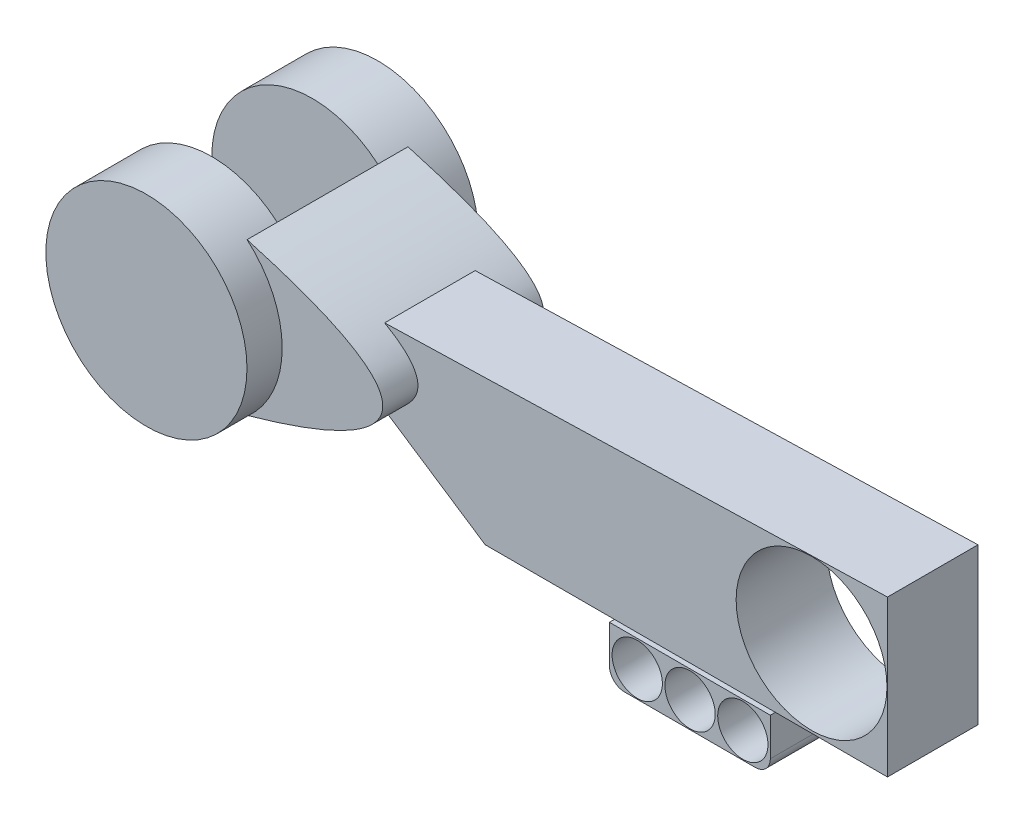
ISO-10303-21;
HEADER;
FILE_DESCRIPTION(('STEP AP214'),'2;1');
FILE_NAME('part.step','',(''),(''),'','','');
FILE_SCHEMA(('AUTOMOTIVE_DESIGN { 1 0 10303 214 1 1 1 1 }'));
ENDSEC;
DATA;
#1=APPLICATION_CONTEXT('core data for automotive mechanical design processes');
#2=APPLICATION_PROTOCOL_DEFINITION('international standard','automotive_design',2000,#1);
#3=PRODUCT_CONTEXT('',#1,'mechanical');
#4=PRODUCT('Part','Part','',(#3));
#5=PRODUCT_RELATED_PRODUCT_CATEGORY('part','',(#4));
#6=PRODUCT_DEFINITION_FORMATION('','',#4);
#7=PRODUCT_DEFINITION_CONTEXT('part definition',#1,'design');
#8=PRODUCT_DEFINITION('design','',#6,#7);
#9=PRODUCT_DEFINITION_SHAPE('','',#8);
#10=(LENGTH_UNIT() NAMED_UNIT(*) SI_UNIT(.MILLI.,.METRE.));
#11=(NAMED_UNIT(*) PLANE_ANGLE_UNIT() SI_UNIT($,.RADIAN.));
#12=(NAMED_UNIT(*) SI_UNIT($,.STERADIAN.) SOLID_ANGLE_UNIT());
#13=UNCERTAINTY_MEASURE_WITH_UNIT(LENGTH_MEASURE(1.E-05),#10,'distance_accuracy_value','');
#14=(GEOMETRIC_REPRESENTATION_CONTEXT(3) GLOBAL_UNCERTAINTY_ASSIGNED_CONTEXT((#13)) GLOBAL_UNIT_ASSIGNED_CONTEXT((#10,
#11,#12)) REPRESENTATION_CONTEXT('',''));
#15=CARTESIAN_POINT('',(0.,0.,0.));
#16=DIRECTION('',(0.,0.,1.));
#17=DIRECTION('',(1.,0.,0.));
#18=AXIS2_PLACEMENT_3D('',#15,#16,#17);
#19=CARTESIAN_POINT('',(0.,-2.06849962744664,-1.3));
#20=DIRECTION('',(0.,1.,0.));
#21=DIRECTION('',(-1.,0.,0.));
#22=AXIS2_PLACEMENT_3D('',#19,#20,#21);
#23=PLANE('',#22);
#24=DIRECTION('',(0.,0.,-1.));
#25=VECTOR('',#24,1.);
#26=CARTESIAN_POINT('',(7.90753190744176,-2.06849962744664,-1.2));
#27=LINE('',#26,#25);
#28=CARTESIAN_POINT('',(7.90753190744176,-2.06849962744664,-1.3));
#29=VERTEX_POINT('',#28);
#30=CARTESIAN_POINT('',(7.90753190744176,-2.06849962744664,-3.1));
#31=VERTEX_POINT('',#30);
#32=EDGE_CURVE('E47',#29,#31,#27,.T.);
#33=ORIENTED_EDGE('',*,*,#32,.F.);
#34=DIRECTION('',(1.,0.,0.));
#35=VECTOR('',#34,1.);
#36=CARTESIAN_POINT('',(0.,-2.06849962744664,-1.3));
#37=LINE('',#36,#35);
#38=CARTESIAN_POINT('',(5.33751299580124,-2.06849962744664,-1.3));
#39=VERTEX_POINT('',#38);
#40=EDGE_CURVE('E278',#39,#29,#37,.T.);
#41=ORIENTED_EDGE('',*,*,#40,.F.);
#42=DIRECTION('',(0.,0.,-1.));
#43=VECTOR('',#42,1.);
#44=CARTESIAN_POINT('',(5.33751299580124,-2.06849962744664,-1.3));
#45=LINE('',#44,#43);
#46=CARTESIAN_POINT('',(5.33751299580124,-2.06849962744664,-3.1));
#47=VERTEX_POINT('',#46);
#48=EDGE_CURVE('E297',#39,#47,#45,.T.);
#49=ORIENTED_EDGE('',*,*,#48,.T.);
#50=DIRECTION('',(1.,0.,0.));
#51=VECTOR('',#50,1.);
#52=CARTESIAN_POINT('',(0.,-2.06849962744664,-3.1));
#53=LINE('',#52,#51);
#54=EDGE_CURVE('E260',#47,#31,#53,.T.);
#55=ORIENTED_EDGE('',*,*,#54,.T.);
#56=EDGE_LOOP('',(#33,#41,#49,#55));
#57=FACE_BOUND('',#56,.T.);
#58=ADVANCED_FACE('F38',(#57),#23,.F.);
#59=CARTESIAN_POINT('',(0.,0.,-2.2));
#60=DIRECTION('',(0.,0.,1.));
#61=DIRECTION('',(1.,0.,0.));
#62=AXIS2_PLACEMENT_3D('',#59,#60,#61);
#63=CYLINDRICAL_SURFACE('',#62,2.);
#64=CARTESIAN_POINT('',(0.,0.,-3.2));
#65=DIRECTION('',(0.,0.,1.));
#66=DIRECTION('',(1.,0.,0.));
#67=AXIS2_PLACEMENT_3D('',#64,#65,#66);
#68=CIRCLE('',#67,2.);
#69=CARTESIAN_POINT('',(1.31954733992159,-1.50292874671618,-3.2));
#70=VERTEX_POINT('',#69);
#71=CARTESIAN_POINT('',(1.30190533383502,1.51823664220434,-3.2));
#72=VERTEX_POINT('',#71);
#73=EDGE_CURVE('E238',#70,#72,#68,.T.);
#74=ORIENTED_EDGE('',*,*,#73,.F.);
#75=DIRECTION('',(0.,0.,1.));
#76=VECTOR('',#75,1.);
#77=CARTESIAN_POINT('',(1.31954733992159,-1.50292874671618,-2.2));
#78=LINE('',#77,#76);
#79=CARTESIAN_POINT('',(1.31954733992159,-1.50292874671618,-1.2));
#80=VERTEX_POINT('',#79);
#81=EDGE_CURVE('E685',#70,#80,#78,.T.);
#82=ORIENTED_EDGE('',*,*,#81,.T.);
#83=CARTESIAN_POINT('',(0.,0.,-1.2));
#84=DIRECTION('',(0.,0.,1.));
#85=DIRECTION('',(1.,0.,0.));
#86=AXIS2_PLACEMENT_3D('',#83,#84,#85);
#87=CIRCLE('',#86,2.);
#88=CARTESIAN_POINT('',(1.30190533383502,1.51823664220434,-1.2));
#89=VERTEX_POINT('',#88);
#90=EDGE_CURVE('E681',#80,#89,#87,.T.);
#91=ORIENTED_EDGE('',*,*,#90,.T.);
#92=DIRECTION('',(0.,0.,1.));
#93=VECTOR('',#92,1.);
#94=CARTESIAN_POINT('',(1.30190533383502,1.51823664220434,-2.2));
#95=LINE('',#94,#93);
#96=EDGE_CURVE('E693',#72,#89,#95,.T.);
#97=ORIENTED_EDGE('',*,*,#96,.F.);
#98=EDGE_LOOP('',(#74,#82,#91,#97));
#99=FACE_BOUND('',#98,.T.);
#100=ADVANCED_FACE('F326',(#99),#63,.F.);
#101=CARTESIAN_POINT('',(1.30190533383502,1.51823664220434,-2.2));
#102=CARTESIAN_POINT('',(6.68928221150625,0.00355034534943547,-2.2));
#103=CARTESIAN_POINT('',(1.31954733992159,-1.50292874671618,-2.2));
#104=B_SPLINE_CURVE_WITH_KNOTS('',2,(#101,#102,#103),.UNSPECIFIED.,.F.,.F.,(3,3),(0.,1.),.UNSPECIFIED.);
#105=DIRECTION('',(0.,0.,1.));
#106=VECTOR('',#105,1.);
#107=SURFACE_OF_LINEAR_EXTRUSION('',#104,#106);
#108=CARTESIAN_POINT('',(1.30190533383502,1.51823664220434,-3.1));
#109=CARTESIAN_POINT('',(6.68928221150625,0.00355034534943547,-3.1));
#110=CARTESIAN_POINT('',(1.31954733992159,-1.50292874671618,-3.1));
#111=B_SPLINE_CURVE_WITH_KNOTS('',2,(#108,#109,#110),.UNSPECIFIED.,.F.,.F.,(3,3),(0.,1.),.UNSPECIFIED.);
#112=CARTESIAN_POINT('',(3.33751296790909,0.753381438044723,-3.1));
#113=VERTEX_POINT('',#112);
#114=CARTESIAN_POINT('',(3.33751300161917,-0.74612100768577,-3.1));
#115=VERTEX_POINT('',#114);
#116=EDGE_CURVE('E248',#113,#115,#111,.T.);
#117=ORIENTED_EDGE('',*,*,#116,.T.);
#118=DIRECTION('',(0.,0.,-1.));
#119=VECTOR('',#118,1.);
#120=CARTESIAN_POINT('',(3.33751300161917,-0.74612100768577,-1.3));
#121=LINE('',#120,#119);
#122=CARTESIAN_POINT('',(3.33751300161917,-0.74612100768577,-1.3));
#123=VERTEX_POINT('',#122);
#124=EDGE_CURVE('E299',#123,#115,#121,.T.);
#125=ORIENTED_EDGE('',*,*,#124,.F.);
#126=CARTESIAN_POINT('',(1.30190533383502,1.51823664220434,-1.3));
#127=CARTESIAN_POINT('',(6.68928221150625,0.00355034534943547,-1.3));
#128=CARTESIAN_POINT('',(1.31954733992159,-1.50292874671618,-1.3));
#129=B_SPLINE_CURVE_WITH_KNOTS('',2,(#126,#127,#128),.UNSPECIFIED.,.F.,.F.,(3,3),(0.,1.),.UNSPECIFIED.);
#130=CARTESIAN_POINT('',(3.33751296790909,0.753381438044723,-1.3));
#131=VERTEX_POINT('',#130);
#132=EDGE_CURVE('E283',#131,#123,#129,.T.);
#133=ORIENTED_EDGE('',*,*,#132,.F.);
#134=DIRECTION('',(0.,0.,-1.));
#135=VECTOR('',#134,1.);
#136=CARTESIAN_POINT('',(3.33751296790909,0.753381438044723,-1.3));
#137=LINE('',#136,#135);
#138=EDGE_CURVE('E296',#131,#113,#137,.T.);
#139=ORIENTED_EDGE('',*,*,#138,.T.);
#140=EDGE_LOOP('',(#117,#125,#133,#139));
#141=FACE_BOUND('',#140,.T.);
#142=CARTESIAN_POINT('',(1.30190533383502,1.51823664220434,-3.8));
#143=CARTESIAN_POINT('',(6.68928221150625,0.00355034534943547,-3.8));
#144=CARTESIAN_POINT('',(1.31954733992159,-1.50292874671618,-3.8));
#145=B_SPLINE_CURVE_WITH_KNOTS('',2,(#142,#143,#144),.UNSPECIFIED.,.F.,.F.,(3,3),(0.,1.),.UNSPECIFIED.);
#146=CARTESIAN_POINT('',(1.30190533383502,1.51823664220434,-3.8));
#147=VERTEX_POINT('',#146);
#148=CARTESIAN_POINT('',(1.31954733992159,-1.50292874671618,-3.8));
#149=VERTEX_POINT('',#148);
#150=EDGE_CURVE('E262',#147,#149,#145,.T.);
#151=ORIENTED_EDGE('',*,*,#150,.F.);
#152=EDGE_CURVE('E316',#147,#72,#95,.T.);
#153=ORIENTED_EDGE('',*,*,#152,.T.);
#154=ORIENTED_EDGE('',*,*,#96,.T.);
#155=CARTESIAN_POINT('',(1.30190533383502,1.51823664220434,-0.6));
#156=VERTEX_POINT('',#155);
#157=EDGE_CURVE('E311',#89,#156,#95,.T.);
#158=ORIENTED_EDGE('',*,*,#157,.T.);
#159=CARTESIAN_POINT('',(1.30190533383502,1.51823664220434,-0.6));
#160=CARTESIAN_POINT('',(6.68928221150625,0.00355034534943547,-0.6));
#161=CARTESIAN_POINT('',(1.31954733992159,-1.50292874671618,-0.6));
#162=B_SPLINE_CURVE_WITH_KNOTS('',2,(#159,#160,#161),.UNSPECIFIED.,.F.,.F.,(3,3),(0.,1.),.UNSPECIFIED.);
#163=CARTESIAN_POINT('',(1.31954733992159,-1.50292874671618,-0.6));
#164=VERTEX_POINT('',#163);
#165=EDGE_CURVE('E295',#156,#164,#162,.T.);
#166=ORIENTED_EDGE('',*,*,#165,.T.);
#167=EDGE_CURVE('E686',#80,#164,#78,.T.);
#168=ORIENTED_EDGE('',*,*,#167,.F.);
#169=ORIENTED_EDGE('',*,*,#81,.F.);
#170=EDGE_CURVE('E684',#149,#70,#78,.T.);
#171=ORIENTED_EDGE('',*,*,#170,.F.);
#172=EDGE_LOOP('',(#151,#153,#154,#158,#166,#168,#169,#171));
#173=FACE_BOUND('',#172,.T.);
#174=ADVANCED_FACE('F322',(#141,#173),#107,.F.);
#175=CARTESIAN_POINT('',(0.,0.,-1.2));
#176=DIRECTION('',(0.,0.,1.));
#177=DIRECTION('',(1.,0.,0.));
#178=AXIS2_PLACEMENT_3D('',#175,#176,#177);
#179=CYLINDRICAL_SURFACE('',#178,2.);
#180=CARTESIAN_POINT('',(0.,0.,0.1));
#181=DIRECTION('',(0.,0.,1.));
#182=DIRECTION('',(1.,0.,0.));
#183=AXIS2_PLACEMENT_3D('',#180,#181,#182);
#184=CIRCLE('',#183,2.);
#185=CARTESIAN_POINT('',(2.,0.,0.1));
#186=VERTEX_POINT('',#185);
#187=EDGE_CURVE('E682',#186,#186,#184,.T.);
#188=ORIENTED_EDGE('',*,*,#187,.F.);
#189=EDGE_LOOP('',(#188));
#190=FACE_BOUND('',#189,.T.);
#191=CARTESIAN_POINT('',(0.,0.,-0.6));
#192=DIRECTION('',(0.,0.,1.));
#193=DIRECTION('',(-1.,0.,0.));
#194=AXIS2_PLACEMENT_3D('',#191,#192,#193);
#195=CIRCLE('',#194,2.);
#196=EDGE_CURVE('E306',#164,#156,#195,.T.);
#197=ORIENTED_EDGE('',*,*,#196,.T.);
#198=ORIENTED_EDGE('',*,*,#157,.F.);
#199=EDGE_CURVE('E670',#89,#80,#87,.T.);
#200=ORIENTED_EDGE('',*,*,#199,.T.);
#201=ORIENTED_EDGE('',*,*,#167,.T.);
#202=EDGE_LOOP('',(#197,#198,#200,#201));
#203=FACE_BOUND('',#202,.T.);
#204=ADVANCED_FACE('F40',(#190,#203),#179,.T.);
#205=CARTESIAN_POINT('',(0.,0.,-1.2));
#206=DIRECTION('',(0.,0.,1.));
#207=DIRECTION('',(1.,0.,0.));
#208=AXIS2_PLACEMENT_3D('',#205,#206,#207);
#209=PLANE('',#208);
#210=ORIENTED_EDGE('',*,*,#199,.F.);
#211=ORIENTED_EDGE('',*,*,#90,.F.);
#212=EDGE_LOOP('',(#210,#211));
#213=FACE_BOUND('',#212,.T.);
#214=ADVANCED_FACE('F332',(#213),#209,.F.);
#215=CARTESIAN_POINT('',(0.,0.,0.1));
#216=DIRECTION('',(0.,0.,1.));
#217=DIRECTION('',(1.,0.,0.));
#218=AXIS2_PLACEMENT_3D('',#215,#216,#217);
#219=PLANE('',#218);
#220=ORIENTED_EDGE('',*,*,#187,.T.);
#221=EDGE_LOOP('',(#220));
#222=FACE_BOUND('',#221,.T.);
#223=ADVANCED_FACE('F329',(#222),#219,.T.);
#224=CARTESIAN_POINT('',(4.00000427419228,0.00560214654675808,-0.6));
#225=DIRECTION('',(0.,0.,1.));
#226=DIRECTION('',(1.,0.,0.));
#227=AXIS2_PLACEMENT_3D('',#224,#225,#226);
#228=PLANE('',#227);
#229=ORIENTED_EDGE('',*,*,#165,.F.);
#230=ORIENTED_EDGE('',*,*,#196,.F.);
#231=EDGE_LOOP('',(#229,#230));
#232=FACE_BOUND('',#231,.T.);
#233=ADVANCED_FACE('F331',(#232),#228,.T.);
#234=CARTESIAN_POINT('',(13.3375129958012,4.32883877576709E-13,-1.3));
#235=DIRECTION('',(-1.,0.,0.));
#236=DIRECTION('',(0.,-1.,0.));
#237=AXIS2_PLACEMENT_3D('',#234,#235,#236);
#238=PLANE('',#237);
#239=DIRECTION('',(0.,0.,-1.));
#240=VECTOR('',#239,1.);
#241=CARTESIAN_POINT('',(13.3375129958012,-2.06849962744664,-1.3));
#242=LINE('',#241,#240);
#243=CARTESIAN_POINT('',(13.3375129958012,-2.06849962744664,-1.3));
#244=VERTEX_POINT('',#243);
#245=CARTESIAN_POINT('',(13.3375129958012,-2.06849962744664,-3.1));
#246=VERTEX_POINT('',#245);
#247=EDGE_CURVE('E292',#244,#246,#242,.T.);
#248=ORIENTED_EDGE('',*,*,#247,.T.);
#249=DIRECTION('',(0.,1.,0.));
#250=VECTOR('',#249,1.);
#251=CARTESIAN_POINT('',(13.3375129958012,4.32883877576709E-13,-3.1));
#252=LINE('',#251,#250);
#253=CARTESIAN_POINT('',(13.3375129958011,1.03150037255336,-3.1));
#254=VERTEX_POINT('',#253);
#255=EDGE_CURVE('E242',#246,#254,#252,.T.);
#256=ORIENTED_EDGE('',*,*,#255,.T.);
#257=DIRECTION('',(0.,0.,-1.));
#258=VECTOR('',#257,1.);
#259=CARTESIAN_POINT('',(13.3375129958011,1.03150037255336,-1.3));
#260=LINE('',#259,#258);
#261=CARTESIAN_POINT('',(13.3375129958011,1.03150037255336,-1.3));
#262=VERTEX_POINT('',#261);
#263=EDGE_CURVE('E293',#262,#254,#260,.T.);
#264=ORIENTED_EDGE('',*,*,#263,.F.);
#265=DIRECTION('',(0.,1.,0.));
#266=VECTOR('',#265,1.);
#267=CARTESIAN_POINT('',(13.3375129958012,4.32883877576709E-13,-1.3));
#268=LINE('',#267,#266);
#269=EDGE_CURVE('E275',#244,#262,#268,.T.);
#270=ORIENTED_EDGE('',*,*,#269,.F.);
#271=EDGE_LOOP('',(#248,#256,#264,#270));
#272=FACE_BOUND('',#271,.T.);
#273=ADVANCED_FACE('F365',(#272),#238,.F.);
#274=CARTESIAN_POINT('',(-0.0183571941936594,0.660048321889685,-1.3));
#275=DIRECTION('',(0.0278011443144739,-0.99961347348603,0.));
#276=DIRECTION('',(0.99961347348603,0.0278011443144739,0.));
#277=AXIS2_PLACEMENT_3D('',#274,#275,#276);
#278=PLANE('',#277);
#279=ORIENTED_EDGE('',*,*,#263,.T.);
#280=DIRECTION('',(-0.99961347348603,-0.0278011443144739,0.));
#281=VECTOR('',#280,1.);
#282=CARTESIAN_POINT('',(-0.0183571941936594,0.660048321889685,-3.1));
#283=LINE('',#282,#281);
#284=EDGE_CURVE('E245',#254,#113,#283,.T.);
#285=ORIENTED_EDGE('',*,*,#284,.T.);
#286=ORIENTED_EDGE('',*,*,#138,.F.);
#287=DIRECTION('',(-0.99961347348603,-0.0278011443144739,0.));
#288=VECTOR('',#287,1.);
#289=CARTESIAN_POINT('',(-0.0183571941936594,0.660048321889685,-1.3));
#290=LINE('',#289,#288);
#291=EDGE_CURVE('E287',#262,#131,#290,.T.);
#292=ORIENTED_EDGE('',*,*,#291,.F.);
#293=EDGE_LOOP('',(#279,#285,#286,#292));
#294=FACE_BOUND('',#293,.T.);
#295=ADVANCED_FACE('F360',(#294),#278,.F.);
#296=CARTESIAN_POINT('',(0.671971165599863,1.01630675925438,-1.3));
#297=DIRECTION('',(0.5515330665401,0.834153029433373,0.));
#298=DIRECTION('',(-0.834153029433373,0.5515330665401,0.));
#299=AXIS2_PLACEMENT_3D('',#296,#297,#298);
#300=PLANE('',#299);
#301=ORIENTED_EDGE('',*,*,#124,.T.);
#302=DIRECTION('',(0.834153029433373,-0.5515330665401,0.));
#303=VECTOR('',#302,1.);
#304=CARTESIAN_POINT('',(0.671971165599863,1.01630675925438,-3.1));
#305=LINE('',#304,#303);
#306=EDGE_CURVE('E253',#115,#47,#305,.T.);
#307=ORIENTED_EDGE('',*,*,#306,.T.);
#308=ORIENTED_EDGE('',*,*,#48,.F.);
#309=DIRECTION('',(0.834153029433373,-0.5515330665401,0.));
#310=VECTOR('',#309,1.);
#311=CARTESIAN_POINT('',(0.671971165599863,1.01630675925438,-1.3));
#312=LINE('',#311,#310);
#313=EDGE_CURVE('E280',#123,#39,#312,.T.);
#314=ORIENTED_EDGE('',*,*,#313,.F.);
#315=EDGE_LOOP('',(#301,#307,#308,#314));
#316=FACE_BOUND('',#315,.T.);
#317=ADVANCED_FACE('F352',(#316),#300,.F.);
#318=CARTESIAN_POINT('',(11.1075319074418,-2.06849962744664,-1.3));
#319=VERTEX_POINT('',#318);
#320=EDGE_CURVE('E56',#319,#244,#37,.T.);
#321=ORIENTED_EDGE('',*,*,#320,.F.);
#322=DIRECTION('',(0.,0.,-1.));
#323=VECTOR('',#322,1.);
#324=CARTESIAN_POINT('',(11.1075319074418,-2.06849962744664,-1.2));
#325=LINE('',#324,#323);
#326=CARTESIAN_POINT('',(11.1075319074418,-2.06849962744664,-3.1));
#327=VERTEX_POINT('',#326);
#328=EDGE_CURVE('E11',#319,#327,#325,.T.);
#329=ORIENTED_EDGE('',*,*,#328,.T.);
#330=EDGE_CURVE('E259',#327,#246,#53,.T.);
#331=ORIENTED_EDGE('',*,*,#330,.T.);
#332=ORIENTED_EDGE('',*,*,#247,.F.);
#333=EDGE_LOOP('',(#321,#329,#331,#332));
#334=FACE_BOUND('',#333,.T.);
#335=ADVANCED_FACE('F343',(#334),#23,.F.);
#336=CARTESIAN_POINT('',(0.,0.,-1.3));
#337=DIRECTION('',(0.,0.,-1.));
#338=DIRECTION('',(-1.,0.,0.));
#339=AXIS2_PLACEMENT_3D('',#336,#337,#338);
#340=PLANE('',#339);
#341=CARTESIAN_POINT('',(11.8275129958012,-0.521079468635167,-1.3));
#342=DIRECTION('',(0.,0.,-1.));
#343=DIRECTION('',(-1.,0.,0.));
#344=AXIS2_PLACEMENT_3D('',#341,#342,#343);
#345=CIRCLE('',#344,1.5);
#346=CARTESIAN_POINT('',(10.3275129958012,-0.521079468635167,-1.3));
#347=VERTEX_POINT('',#346);
#348=EDGE_CURVE('E274',#347,#347,#345,.T.);
#349=ORIENTED_EDGE('',*,*,#348,.T.);
#350=EDGE_LOOP('',(#349));
#351=FACE_BOUND('',#350,.T.);
#352=ORIENTED_EDGE('',*,*,#269,.T.);
#353=ORIENTED_EDGE('',*,*,#291,.T.);
#354=ORIENTED_EDGE('',*,*,#132,.T.);
#355=ORIENTED_EDGE('',*,*,#313,.T.);
#356=ORIENTED_EDGE('',*,*,#40,.T.);
#357=EDGE_CURVE('E281',#29,#319,#37,.T.);
#358=ORIENTED_EDGE('',*,*,#357,.T.);
#359=ORIENTED_EDGE('',*,*,#320,.T.);
#360=EDGE_LOOP('',(#352,#353,#354,#355,#356,#358,#359));
#361=FACE_BOUND('',#360,.T.);
#362=ADVANCED_FACE('F351',(#351,#361),#340,.F.);
#363=CARTESIAN_POINT('',(11.8275129958012,-0.521079468635167,-3.8));
#364=DIRECTION('',(0.,0.,1.));
#365=DIRECTION('',(1.,0.,0.));
#366=AXIS2_PLACEMENT_3D('',#363,#364,#365);
#367=CYLINDRICAL_SURFACE('',#366,1.5);
#368=ORIENTED_EDGE('',*,*,#348,.F.);
#369=EDGE_LOOP('',(#368));
#370=FACE_BOUND('',#369,.T.);
#371=CARTESIAN_POINT('',(11.8275129958012,-0.521079468635167,-3.1));
#372=DIRECTION('',(0.,0.,1.));
#373=DIRECTION('',(1.,0.,0.));
#374=AXIS2_PLACEMENT_3D('',#371,#372,#373);
#375=CIRCLE('',#374,1.5);
#376=CARTESIAN_POINT('',(13.3275129958012,-0.521079468635167,-3.1));
#377=VERTEX_POINT('',#376);
#378=EDGE_CURVE('E42',#377,#377,#375,.F.);
#379=ORIENTED_EDGE('',*,*,#378,.T.);
#380=EDGE_LOOP('',(#379));
#381=FACE_BOUND('',#380,.T.);
#382=ADVANCED_FACE('F357',(#370,#381),#367,.F.);
#383=CARTESIAN_POINT('',(4.00000427419228,0.00560214654675808,-3.8));
#384=DIRECTION('',(0.,0.,-1.));
#385=DIRECTION('',(1.,0.,0.));
#386=AXIS2_PLACEMENT_3D('',#383,#384,#385);
#387=PLANE('',#386);
#388=ORIENTED_EDGE('',*,*,#150,.T.);
#389=CARTESIAN_POINT('',(0.,0.,-3.8));
#390=DIRECTION('',(0.,0.,1.));
#391=DIRECTION('',(-1.,0.,0.));
#392=AXIS2_PLACEMENT_3D('',#389,#390,#391);
#393=CIRCLE('',#392,2.);
#394=EDGE_CURVE('E268',#149,#147,#393,.T.);
#395=ORIENTED_EDGE('',*,*,#394,.T.);
#396=EDGE_LOOP('',(#388,#395));
#397=FACE_BOUND('',#396,.T.);
#398=ADVANCED_FACE('F371',(#397),#387,.T.);
#399=CARTESIAN_POINT('',(0.,0.,-3.1));
#400=DIRECTION('',(0.,0.,1.));
#401=DIRECTION('',(-1.,0.,0.));
#402=AXIS2_PLACEMENT_3D('',#399,#400,#401);
#403=PLANE('',#402);
#404=ORIENTED_EDGE('',*,*,#378,.F.);
#405=EDGE_LOOP('',(#404));
#406=FACE_BOUND('',#405,.T.);
#407=ORIENTED_EDGE('',*,*,#255,.F.);
#408=ORIENTED_EDGE('',*,*,#330,.F.);
#409=EDGE_CURVE('E263',#31,#327,#53,.T.);
#410=ORIENTED_EDGE('',*,*,#409,.F.);
#411=ORIENTED_EDGE('',*,*,#54,.F.);
#412=ORIENTED_EDGE('',*,*,#306,.F.);
#413=ORIENTED_EDGE('',*,*,#116,.F.);
#414=ORIENTED_EDGE('',*,*,#284,.F.);
#415=EDGE_LOOP('',(#407,#408,#410,#411,#412,#413,#414));
#416=FACE_BOUND('',#415,.T.);
#417=ADVANCED_FACE('F375',(#406,#416),#403,.F.);
#418=CARTESIAN_POINT('',(0.,0.,-3.2));
#419=DIRECTION('',(0.,0.,-1.));
#420=DIRECTION('',(-1.,0.,0.));
#421=AXIS2_PLACEMENT_3D('',#418,#419,#420);
#422=CYLINDRICAL_SURFACE('',#421,2.);
#423=CARTESIAN_POINT('',(0.,0.,-4.5));
#424=DIRECTION('',(0.,0.,1.));
#425=DIRECTION('',(1.,0.,0.));
#426=AXIS2_PLACEMENT_3D('',#423,#424,#425);
#427=CIRCLE('',#426,2.);
#428=CARTESIAN_POINT('',(2.,0.,-4.5));
#429=VERTEX_POINT('',#428);
#430=EDGE_CURVE('E235',#429,#429,#427,.T.);
#431=ORIENTED_EDGE('',*,*,#430,.T.);
#432=EDGE_LOOP('',(#431));
#433=FACE_BOUND('',#432,.T.);
#434=EDGE_CURVE('E239',#72,#70,#68,.T.);
#435=ORIENTED_EDGE('',*,*,#434,.F.);
#436=ORIENTED_EDGE('',*,*,#152,.F.);
#437=ORIENTED_EDGE('',*,*,#394,.F.);
#438=ORIENTED_EDGE('',*,*,#170,.T.);
#439=EDGE_LOOP('',(#435,#436,#437,#438));
#440=FACE_BOUND('',#439,.T.);
#441=ADVANCED_FACE('F379',(#433,#440),#422,.T.);
#442=CARTESIAN_POINT('',(0.,0.,-3.2));
#443=DIRECTION('',(0.,0.,-1.));
#444=DIRECTION('',(1.,0.,0.));
#445=AXIS2_PLACEMENT_3D('',#442,#443,#444);
#446=PLANE('',#445);
#447=ORIENTED_EDGE('',*,*,#434,.T.);
#448=ORIENTED_EDGE('',*,*,#73,.T.);
#449=EDGE_LOOP('',(#447,#448));
#450=FACE_BOUND('',#449,.T.);
#451=ADVANCED_FACE('F383',(#450),#446,.F.);
#452=CARTESIAN_POINT('',(0.,0.,-4.5));
#453=DIRECTION('',(0.,0.,-1.));
#454=DIRECTION('',(1.,0.,0.));
#455=AXIS2_PLACEMENT_3D('',#452,#453,#454);
#456=PLANE('',#455);
#457=ORIENTED_EDGE('',*,*,#430,.F.);
#458=EDGE_LOOP('',(#457));
#459=FACE_BOUND('',#458,.T.);
#460=ADVANCED_FACE('F387',(#459),#456,.T.);
#461=CARTESIAN_POINT('',(11.1075319074418,-2.06849962744664,-1.2));
#462=DIRECTION('',(0.,1.,0.));
#463=DIRECTION('',(-1.,0.,0.));
#464=AXIS2_PLACEMENT_3D('',#461,#462,#463);
#465=PLANE('',#464);
#466=ORIENTED_EDGE('',*,*,#357,.F.);
#467=CARTESIAN_POINT('',(7.90753190744176,-2.06849962744664,-1.2));
#468=VERTEX_POINT('',#467);
#469=EDGE_CURVE('E226',#468,#29,#27,.T.);
#470=ORIENTED_EDGE('',*,*,#469,.F.);
#471=DIRECTION('',(1.,0.,0.));
#472=VECTOR('',#471,1.);
#473=CARTESIAN_POINT('',(11.1075319074418,-2.06849962744664,-1.2));
#474=LINE('',#473,#472);
#475=CARTESIAN_POINT('',(11.1075319074418,-2.06849962744664,-1.2));
#476=VERTEX_POINT('',#475);
#477=EDGE_CURVE('E172',#468,#476,#474,.T.);
#478=ORIENTED_EDGE('',*,*,#477,.T.);
#479=EDGE_CURVE('E49',#476,#319,#325,.T.);
#480=ORIENTED_EDGE('',*,*,#479,.T.);
#481=EDGE_LOOP('',(#466,#470,#478,#480));
#482=FACE_BOUND('',#481,.T.);
#483=ADVANCED_FACE('F391',(#482),#465,.T.);
#484=CARTESIAN_POINT('',(11.1075319074418,-2.06849962744664,-1.2));
#485=DIRECTION('',(1.,0.,0.));
#486=DIRECTION('',(0.,0.,-1.));
#487=AXIS2_PLACEMENT_3D('',#484,#485,#486);
#488=PLANE('',#487);
#489=DIRECTION('',(0.,0.,-1.));
#490=VECTOR('',#489,1.);
#491=CARTESIAN_POINT('',(11.1075319074418,-2.81849962744664,-1.2));
#492=LINE('',#491,#490);
#493=CARTESIAN_POINT('',(11.1075319074418,-2.81849962744664,-1.2));
#494=VERTEX_POINT('',#493);
#495=CARTESIAN_POINT('',(11.1075319074418,-2.81849962744664,-3.2001));
#496=VERTEX_POINT('',#495);
#497=EDGE_CURVE('E160',#494,#496,#492,.T.);
#498=ORIENTED_EDGE('',*,*,#497,.T.);
#499=DIRECTION('',(0.,-1.,0.));
#500=VECTOR('',#499,1.);
#501=CARTESIAN_POINT('',(11.1075319074418,-2.06849962744664,-3.2001));
#502=LINE('',#501,#500);
#503=CARTESIAN_POINT('',(11.1075319074418,-2.06849962744664,-3.2001));
#504=VERTEX_POINT('',#503);
#505=EDGE_CURVE('E165',#504,#496,#502,.T.);
#506=ORIENTED_EDGE('',*,*,#505,.F.);
#507=EDGE_CURVE('E50',#327,#504,#325,.T.);
#508=ORIENTED_EDGE('',*,*,#507,.F.);
#509=ORIENTED_EDGE('',*,*,#328,.F.);
#510=ORIENTED_EDGE('',*,*,#479,.F.);
#511=DIRECTION('',(0.,-1.,0.));
#512=VECTOR('',#511,1.);
#513=CARTESIAN_POINT('',(11.1075319074418,-2.06849962744664,-1.2));
#514=LINE('',#513,#512);
#515=EDGE_CURVE('E167',#476,#494,#514,.T.);
#516=ORIENTED_EDGE('',*,*,#515,.T.);
#517=EDGE_LOOP('',(#498,#506,#508,#509,#510,#516));
#518=FACE_BOUND('',#517,.T.);
#519=ADVANCED_FACE('F162',(#518),#488,.T.);
#520=CARTESIAN_POINT('',(7.90753190744176,-2.06849962744664,-3.2001));
#521=VERTEX_POINT('',#520);
#522=EDGE_CURVE('E229',#31,#521,#27,.T.);
#523=ORIENTED_EDGE('',*,*,#522,.F.);
#524=ORIENTED_EDGE('',*,*,#409,.T.);
#525=ORIENTED_EDGE('',*,*,#507,.T.);
#526=DIRECTION('',(1.,0.,0.));
#527=VECTOR('',#526,1.);
#528=CARTESIAN_POINT('',(11.1075319074418,-2.06849962744664,-3.2001));
#529=LINE('',#528,#527);
#530=EDGE_CURVE('E187',#521,#504,#529,.T.);
#531=ORIENTED_EDGE('',*,*,#530,.F.);
#532=EDGE_LOOP('',(#523,#524,#525,#531));
#533=FACE_BOUND('',#532,.T.);
#534=ADVANCED_FACE('F395',(#533),#465,.T.);
#535=CARTESIAN_POINT('',(7.90753190744176,-2.06849962744664,-1.2));
#536=DIRECTION('',(-1.,0.,0.));
#537=DIRECTION('',(0.,0.,1.));
#538=AXIS2_PLACEMENT_3D('',#535,#536,#537);
#539=PLANE('',#538);
#540=ORIENTED_EDGE('',*,*,#469,.T.);
#541=ORIENTED_EDGE('',*,*,#32,.T.);
#542=ORIENTED_EDGE('',*,*,#522,.T.);
#543=DIRECTION('',(0.,1.,0.));
#544=VECTOR('',#543,1.);
#545=CARTESIAN_POINT('',(7.90753190744176,-2.06849962744664,-3.2001));
#546=LINE('',#545,#544);
#547=CARTESIAN_POINT('',(7.90753190744176,-2.81849962744664,-3.2001));
#548=VERTEX_POINT('',#547);
#549=EDGE_CURVE('E199',#548,#521,#546,.T.);
#550=ORIENTED_EDGE('',*,*,#549,.F.);
#551=DIRECTION('',(0.,0.,-1.));
#552=VECTOR('',#551,1.);
#553=CARTESIAN_POINT('',(7.90753190744176,-2.81849962744664,-1.2));
#554=LINE('',#553,#552);
#555=CARTESIAN_POINT('',(7.90753190744176,-2.81849962744664,-1.2));
#556=VERTEX_POINT('',#555);
#557=EDGE_CURVE('E230',#556,#548,#554,.T.);
#558=ORIENTED_EDGE('',*,*,#557,.F.);
#559=DIRECTION('',(0.,1.,0.));
#560=VECTOR('',#559,1.);
#561=CARTESIAN_POINT('',(7.90753190744176,-2.06849962744664,-1.2));
#562=LINE('',#561,#560);
#563=EDGE_CURVE('E220',#556,#468,#562,.T.);
#564=ORIENTED_EDGE('',*,*,#563,.T.);
#565=EDGE_LOOP('',(#540,#541,#542,#550,#558,#564));
#566=FACE_BOUND('',#565,.T.);
#567=ADVANCED_FACE('F406',(#566),#539,.T.);
#568=CARTESIAN_POINT('',(8.20753190744176,-2.81849962744664,-1.2));
#569=DIRECTION('',(0.,0.,-1.));
#570=DIRECTION('',(-1.,0.,0.));
#571=AXIS2_PLACEMENT_3D('',#568,#569,#570);
#572=CYLINDRICAL_SURFACE('',#571,0.3);
#573=ORIENTED_EDGE('',*,*,#557,.T.);
#574=CARTESIAN_POINT('',(8.20753190744176,-2.81849962744664,-3.2001));
#575=DIRECTION('',(0.,0.,-1.));
#576=DIRECTION('',(-1.,0.,0.));
#577=AXIS2_PLACEMENT_3D('',#574,#575,#576);
#578=CIRCLE('',#577,0.3);
#579=CARTESIAN_POINT('',(8.20753190744177,-3.11849962744664,-3.2001));
#580=VERTEX_POINT('',#579);
#581=EDGE_CURVE('E196',#580,#548,#578,.T.);
#582=ORIENTED_EDGE('',*,*,#581,.F.);
#583=DIRECTION('',(0.,0.,-1.));
#584=VECTOR('',#583,1.);
#585=CARTESIAN_POINT('',(8.20753190744177,-3.11849962744664,-1.2));
#586=LINE('',#585,#584);
#587=CARTESIAN_POINT('',(8.20753190744177,-3.11849962744664,-1.2));
#588=VERTEX_POINT('',#587);
#589=EDGE_CURVE('E232',#588,#580,#586,.T.);
#590=ORIENTED_EDGE('',*,*,#589,.F.);
#591=CARTESIAN_POINT('',(8.20753190744176,-2.81849962744664,-1.2));
#592=DIRECTION('',(0.,0.,-1.));
#593=DIRECTION('',(-1.,0.,0.));
#594=AXIS2_PLACEMENT_3D('',#591,#592,#593);
#595=CIRCLE('',#594,0.3);
#596=EDGE_CURVE('E217',#588,#556,#595,.T.);
#597=ORIENTED_EDGE('',*,*,#596,.T.);
#598=EDGE_LOOP('',(#573,#582,#590,#597));
#599=FACE_BOUND('',#598,.T.);
#600=ADVANCED_FACE('F402',(#599),#572,.T.);
#601=CARTESIAN_POINT('',(10.8075319074418,-3.11849962744664,-1.2));
#602=DIRECTION('',(0.,-1.,0.));
#603=DIRECTION('',(0.,0.,-1.));
#604=AXIS2_PLACEMENT_3D('',#601,#602,#603);
#605=PLANE('',#604);
#606=ORIENTED_EDGE('',*,*,#589,.T.);
#607=DIRECTION('',(-1.,0.,0.));
#608=VECTOR('',#607,1.);
#609=CARTESIAN_POINT('',(10.8075319074418,-3.11849962744664,-3.2001));
#610=LINE('',#609,#608);
#611=CARTESIAN_POINT('',(10.8075319074418,-3.11849962744664,-3.2001));
#612=VERTEX_POINT('',#611);
#613=EDGE_CURVE('E180',#612,#580,#610,.T.);
#614=ORIENTED_EDGE('',*,*,#613,.F.);
#615=DIRECTION('',(0.,0.,-1.));
#616=VECTOR('',#615,1.);
#617=CARTESIAN_POINT('',(10.8075319074418,-3.11849962744664,-1.2));
#618=LINE('',#617,#616);
#619=CARTESIAN_POINT('',(10.8075319074418,-3.11849962744664,-1.2));
#620=VERTEX_POINT('',#619);
#621=EDGE_CURVE('E171',#620,#612,#618,.T.);
#622=ORIENTED_EDGE('',*,*,#621,.F.);
#623=DIRECTION('',(-1.,0.,0.));
#624=VECTOR('',#623,1.);
#625=CARTESIAN_POINT('',(10.8075319074418,-3.11849962744664,-1.2));
#626=LINE('',#625,#624);
#627=EDGE_CURVE('E214',#620,#588,#626,.T.);
#628=ORIENTED_EDGE('',*,*,#627,.T.);
#629=EDGE_LOOP('',(#606,#614,#622,#628));
#630=FACE_BOUND('',#629,.T.);
#631=ADVANCED_FACE('F399',(#630),#605,.T.);
#632=CARTESIAN_POINT('',(10.8075319074418,-2.81849962744664,-1.2));
#633=DIRECTION('',(0.,0.,-1.));
#634=DIRECTION('',(-1.,0.,0.));
#635=AXIS2_PLACEMENT_3D('',#632,#633,#634);
#636=CYLINDRICAL_SURFACE('',#635,0.3);
#637=ORIENTED_EDGE('',*,*,#621,.T.);
#638=CARTESIAN_POINT('',(10.8075319074418,-2.81849962744664,-3.2001));
#639=DIRECTION('',(0.,0.,-1.));
#640=DIRECTION('',(-1.,0.,0.));
#641=AXIS2_PLACEMENT_3D('',#638,#639,#640);
#642=CIRCLE('',#641,0.3);
#643=EDGE_CURVE('E175',#496,#612,#642,.T.);
#644=ORIENTED_EDGE('',*,*,#643,.F.);
#645=ORIENTED_EDGE('',*,*,#497,.F.);
#646=CARTESIAN_POINT('',(10.8075319074418,-2.81849962744664,-1.2));
#647=DIRECTION('',(0.,0.,-1.));
#648=DIRECTION('',(-1.,0.,0.));
#649=AXIS2_PLACEMENT_3D('',#646,#647,#648);
#650=CIRCLE('',#649,0.3);
#651=EDGE_CURVE('E212',#494,#620,#650,.T.);
#652=ORIENTED_EDGE('',*,*,#651,.T.);
#653=EDGE_LOOP('',(#637,#644,#645,#652));
#654=FACE_BOUND('',#653,.T.);
#655=ADVANCED_FACE('F176',(#654),#636,.T.);
#656=CARTESIAN_POINT('',(10.8075319074418,-2.81849962744664,-1.2));
#657=DIRECTION('',(0.,0.,-1.));
#658=DIRECTION('',(-1.,0.,0.));
#659=AXIS2_PLACEMENT_3D('',#656,#657,#658);
#660=PLANE('',#659);
#661=CARTESIAN_POINT('',(8.46092933249947,-2.60174704539925,-1.2));
#662=DIRECTION('',(0.,0.,-1.));
#663=DIRECTION('',(-1.,0.,0.));
#664=AXIS2_PLACEMENT_3D('',#661,#662,#663);
#665=CIRCLE('',#664,0.500000000000002);
#666=CARTESIAN_POINT('',(7.96092933249947,-2.60174704539925,-1.2));
#667=VERTEX_POINT('',#666);
#668=EDGE_CURVE('E202',#667,#667,#665,.T.);
#669=ORIENTED_EDGE('',*,*,#668,.T.);
#670=EDGE_LOOP('',(#669));
#671=FACE_BOUND('',#670,.T.);
#672=CARTESIAN_POINT('',(9.51092933249947,-2.60174704539927,-1.2));
#673=DIRECTION('',(0.,0.,-1.));
#674=DIRECTION('',(-1.,0.,0.));
#675=AXIS2_PLACEMENT_3D('',#672,#673,#674);
#676=CIRCLE('',#675,0.500000000000001);
#677=CARTESIAN_POINT('',(9.01092933249947,-2.60174704539927,-1.2));
#678=VERTEX_POINT('',#677);
#679=EDGE_CURVE('E205',#678,#678,#676,.T.);
#680=ORIENTED_EDGE('',*,*,#679,.T.);
#681=EDGE_LOOP('',(#680));
#682=FACE_BOUND('',#681,.T.);
#683=CARTESIAN_POINT('',(10.5609293324995,-2.60174704539928,-1.2));
#684=DIRECTION('',(0.,0.,-1.));
#685=DIRECTION('',(-1.,0.,0.));
#686=AXIS2_PLACEMENT_3D('',#683,#684,#685);
#687=CIRCLE('',#686,0.500000000000001);
#688=CARTESIAN_POINT('',(10.0609293324995,-2.60174704539928,-1.2));
#689=VERTEX_POINT('',#688);
#690=EDGE_CURVE('E208',#689,#689,#687,.T.);
#691=ORIENTED_EDGE('',*,*,#690,.T.);
#692=EDGE_LOOP('',(#691));
#693=FACE_BOUND('',#692,.T.);
#694=ORIENTED_EDGE('',*,*,#515,.F.);
#695=ORIENTED_EDGE('',*,*,#477,.F.);
#696=ORIENTED_EDGE('',*,*,#563,.F.);
#697=ORIENTED_EDGE('',*,*,#596,.F.);
#698=ORIENTED_EDGE('',*,*,#627,.F.);
#699=ORIENTED_EDGE('',*,*,#651,.F.);
#700=EDGE_LOOP('',(#694,#695,#696,#697,#698,#699));
#701=FACE_BOUND('',#700,.T.);
#702=ADVANCED_FACE('F398',(#671,#682,#693,#701),#660,.F.);
#703=CARTESIAN_POINT('',(10.5609293324995,-2.60174704539928,-1.2));
#704=DIRECTION('',(0.,0.,-1.));
#705=DIRECTION('',(-1.,0.,0.));
#706=AXIS2_PLACEMENT_3D('',#703,#704,#705);
#707=CYLINDRICAL_SURFACE('',#706,0.500000000000001);
#708=ORIENTED_EDGE('',*,*,#690,.F.);
#709=EDGE_LOOP('',(#708));
#710=FACE_BOUND('',#709,.T.);
#711=CARTESIAN_POINT('',(10.5609293324995,-2.60174704539928,-3.2001));
#712=DIRECTION('',(0.,0.,-1.));
#713=DIRECTION('',(-1.,0.,0.));
#714=AXIS2_PLACEMENT_3D('',#711,#712,#713);
#715=CIRCLE('',#714,0.500000000000001);
#716=CARTESIAN_POINT('',(10.0609293324995,-2.60174704539928,-3.2001));
#717=VERTEX_POINT('',#716);
#718=EDGE_CURVE('E188',#717,#717,#715,.T.);
#719=ORIENTED_EDGE('',*,*,#718,.T.);
#720=EDGE_LOOP('',(#719));
#721=FACE_BOUND('',#720,.T.);
#722=ADVANCED_FACE('F416',(#710,#721),#707,.F.);
#723=CARTESIAN_POINT('',(9.51092933249947,-2.60174704539927,-1.2));
#724=DIRECTION('',(0.,0.,-1.));
#725=DIRECTION('',(-1.,0.,0.));
#726=AXIS2_PLACEMENT_3D('',#723,#724,#725);
#727=CYLINDRICAL_SURFACE('',#726,0.500000000000001);
#728=ORIENTED_EDGE('',*,*,#679,.F.);
#729=EDGE_LOOP('',(#728));
#730=FACE_BOUND('',#729,.T.);
#731=CARTESIAN_POINT('',(9.51092933249947,-2.60174704539927,-3.2001));
#732=DIRECTION('',(0.,0.,-1.));
#733=DIRECTION('',(-1.,0.,0.));
#734=AXIS2_PLACEMENT_3D('',#731,#732,#733);
#735=CIRCLE('',#734,0.500000000000001);
#736=CARTESIAN_POINT('',(9.01092933249947,-2.60174704539927,-3.2001));
#737=VERTEX_POINT('',#736);
#738=EDGE_CURVE('E191',#737,#737,#735,.T.);
#739=ORIENTED_EDGE('',*,*,#738,.T.);
#740=EDGE_LOOP('',(#739));
#741=FACE_BOUND('',#740,.T.);
#742=ADVANCED_FACE('F420',(#730,#741),#727,.F.);
#743=CARTESIAN_POINT('',(8.46092933249947,-2.60174704539925,-1.2));
#744=DIRECTION('',(0.,0.,-1.));
#745=DIRECTION('',(-1.,0.,0.));
#746=AXIS2_PLACEMENT_3D('',#743,#744,#745);
#747=CYLINDRICAL_SURFACE('',#746,0.500000000000002);
#748=ORIENTED_EDGE('',*,*,#668,.F.);
#749=EDGE_LOOP('',(#748));
#750=FACE_BOUND('',#749,.T.);
#751=CARTESIAN_POINT('',(8.46092933249947,-2.60174704539925,-3.2001));
#752=DIRECTION('',(0.,0.,-1.));
#753=DIRECTION('',(-1.,0.,0.));
#754=AXIS2_PLACEMENT_3D('',#751,#752,#753);
#755=CIRCLE('',#754,0.500000000000002);
#756=CARTESIAN_POINT('',(7.96092933249947,-2.60174704539925,-3.2001));
#757=VERTEX_POINT('',#756);
#758=EDGE_CURVE('E436',#757,#757,#755,.T.);
#759=ORIENTED_EDGE('',*,*,#758,.T.);
#760=EDGE_LOOP('',(#759));
#761=FACE_BOUND('',#760,.T.);
#762=ADVANCED_FACE('F424',(#750,#761),#747,.F.);
#763=CARTESIAN_POINT('',(10.8075319074418,-2.81849962744664,-3.2001));
#764=DIRECTION('',(0.,0.,-1.));
#765=DIRECTION('',(-1.,0.,0.));
#766=AXIS2_PLACEMENT_3D('',#763,#764,#765);
#767=PLANE('',#766);
#768=ORIENTED_EDGE('',*,*,#738,.F.);
#769=EDGE_LOOP('',(#768));
#770=FACE_BOUND('',#769,.T.);
#771=ORIENTED_EDGE('',*,*,#505,.T.);
#772=ORIENTED_EDGE('',*,*,#643,.T.);
#773=ORIENTED_EDGE('',*,*,#613,.T.);
#774=ORIENTED_EDGE('',*,*,#581,.T.);
#775=ORIENTED_EDGE('',*,*,#549,.T.);
#776=ORIENTED_EDGE('',*,*,#530,.T.);
#777=EDGE_LOOP('',(#771,#772,#773,#774,#775,#776));
#778=FACE_BOUND('',#777,.T.);
#779=ORIENTED_EDGE('',*,*,#718,.F.);
#780=EDGE_LOOP('',(#779));
#781=FACE_BOUND('',#780,.T.);
#782=ORIENTED_EDGE('',*,*,#758,.F.);
#783=EDGE_LOOP('',(#782));
#784=FACE_BOUND('',#783,.T.);
#785=ADVANCED_FACE('F183',(#770,#778,#781,#784),#767,.T.);
#786=CLOSED_SHELL('',(#58,#100,#174,#204,#214,#223,#233,#273,#295,#317,#335,#362,#382,#398,#417,
#441,#451,#460,#483,#519,#534,#567,#600,#631,#655,#702,#722,#742,#762,#785));
#787=MANIFOLD_SOLID_BREP('B2',#786);
#788=ADVANCED_BREP_SHAPE_REPRESENTATION('',(#18,#787),#14);
#789=SHAPE_DEFINITION_REPRESENTATION(#9,#788);
ENDSEC;
END-ISO-10303-21;
